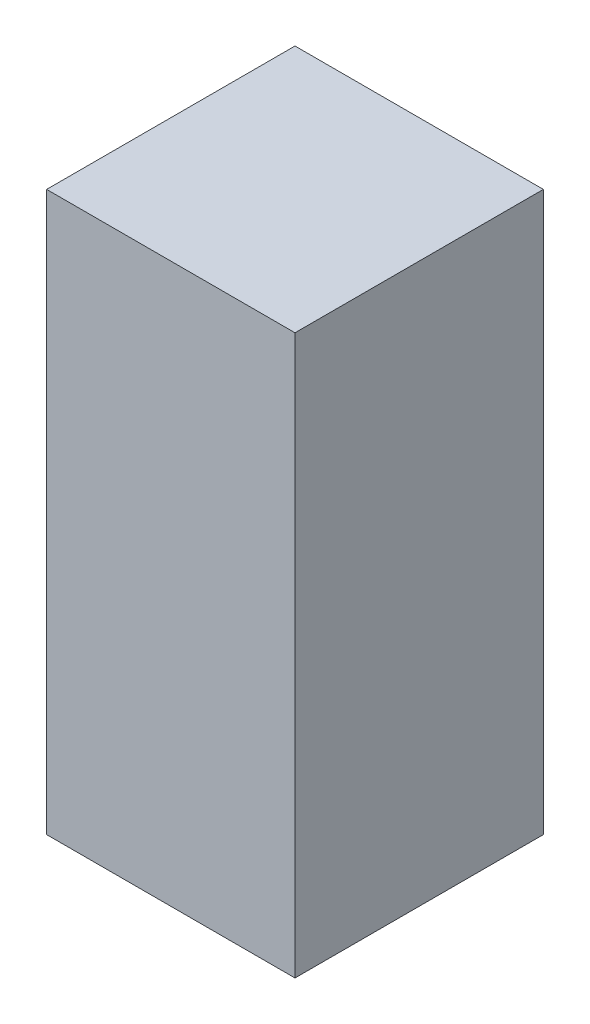
ISO-10303-21;
HEADER;
FILE_DESCRIPTION(('STEP AP214'),'2;1');
FILE_NAME('part.step','',(''),(''),'','','');
FILE_SCHEMA(('AUTOMOTIVE_DESIGN { 1 0 10303 214 1 1 1 1 }'));
ENDSEC;
DATA;
#1=APPLICATION_CONTEXT('core data for automotive mechanical design processes');
#2=APPLICATION_PROTOCOL_DEFINITION('international standard','automotive_design',2000,#1);
#3=PRODUCT_CONTEXT('',#1,'mechanical');
#4=PRODUCT('Part','Part','',(#3));
#5=PRODUCT_RELATED_PRODUCT_CATEGORY('part','',(#4));
#6=PRODUCT_DEFINITION_FORMATION('','',#4);
#7=PRODUCT_DEFINITION_CONTEXT('part definition',#1,'design');
#8=PRODUCT_DEFINITION('design','',#6,#7);
#9=PRODUCT_DEFINITION_SHAPE('','',#8);
#10=(LENGTH_UNIT() NAMED_UNIT(*) SI_UNIT(.MILLI.,.METRE.));
#11=(NAMED_UNIT(*) PLANE_ANGLE_UNIT() SI_UNIT($,.RADIAN.));
#12=(NAMED_UNIT(*) SI_UNIT($,.STERADIAN.) SOLID_ANGLE_UNIT());
#13=UNCERTAINTY_MEASURE_WITH_UNIT(LENGTH_MEASURE(1.E-05),#10,'distance_accuracy_value','');
#14=(GEOMETRIC_REPRESENTATION_CONTEXT(3) GLOBAL_UNCERTAINTY_ASSIGNED_CONTEXT((#13)) GLOBAL_UNIT_ASSIGNED_CONTEXT((#10,
#11,#12)) REPRESENTATION_CONTEXT('',''));
#15=CARTESIAN_POINT('',(0.,0.,0.));
#16=DIRECTION('',(0.,0.,1.));
#17=DIRECTION('',(1.,0.,0.));
#18=AXIS2_PLACEMENT_3D('',#15,#16,#17);
#19=CARTESIAN_POINT('',(-20.,90.,20.));
#20=DIRECTION('',(1.,0.,0.));
#21=DIRECTION('',(0.,0.,-1.));
#22=AXIS2_PLACEMENT_3D('',#19,#20,#21);
#23=PLANE('',#22);
#24=CARTESIAN_POINT('',(-20.,27.5,0.));
#25=DIRECTION('',(-1.,0.,0.));
#26=DIRECTION('',(0.,0.,1.));
#27=AXIS2_PLACEMENT_3D('',#24,#25,#26);
#28=CIRCLE('',#27,2.5);
#29=CARTESIAN_POINT('',(-20.,27.5,2.5));
#30=VERTEX_POINT('',#29);
#31=EDGE_CURVE('E138',#30,#30,#28,.T.);
#32=ORIENTED_EDGE('',*,*,#31,.F.);
#33=EDGE_LOOP('',(#32));
#34=FACE_BOUND('',#33,.T.);
#35=CARTESIAN_POINT('',(-20.,68.3,0.));
#36=DIRECTION('',(-1.,0.,0.));
#37=DIRECTION('',(0.,0.,1.));
#38=AXIS2_PLACEMENT_3D('',#35,#36,#37);
#39=CIRCLE('',#38,3.);
#40=CARTESIAN_POINT('',(-20.,68.3,3.00000000000001));
#41=VERTEX_POINT('',#40);
#42=EDGE_CURVE('E134',#41,#41,#39,.T.);
#43=ORIENTED_EDGE('',*,*,#42,.F.);
#44=EDGE_LOOP('',(#43));
#45=FACE_BOUND('',#44,.T.);
#46=DIRECTION('',(0.,0.,1.));
#47=VECTOR('',#46,1.);
#48=CARTESIAN_POINT('',(-20.,0.,20.));
#49=LINE('',#48,#47);
#50=CARTESIAN_POINT('',(-20.,0.,-20.));
#51=VERTEX_POINT('',#50);
#52=CARTESIAN_POINT('',(-20.,0.,20.));
#53=VERTEX_POINT('',#52);
#54=EDGE_CURVE('E115',#51,#53,#49,.T.);
#55=ORIENTED_EDGE('',*,*,#54,.T.);
#56=DIRECTION('',(0.,-1.,0.));
#57=VECTOR('',#56,1.);
#58=CARTESIAN_POINT('',(-20.,90.,20.));
#59=LINE('',#58,#57);
#60=CARTESIAN_POINT('',(-20.,90.,20.));
#61=VERTEX_POINT('',#60);
#62=EDGE_CURVE('E11',#61,#53,#59,.T.);
#63=ORIENTED_EDGE('',*,*,#62,.F.);
#64=DIRECTION('',(0.,0.,1.));
#65=VECTOR('',#64,1.);
#66=CARTESIAN_POINT('',(-20.,90.,20.));
#67=LINE('',#66,#65);
#68=CARTESIAN_POINT('',(-20.,90.,-20.));
#69=VERTEX_POINT('',#68);
#70=EDGE_CURVE('E102',#69,#61,#67,.T.);
#71=ORIENTED_EDGE('',*,*,#70,.F.);
#72=DIRECTION('',(0.,-1.,0.));
#73=VECTOR('',#72,1.);
#74=CARTESIAN_POINT('',(-20.,90.,-20.));
#75=LINE('',#74,#73);
#76=EDGE_CURVE('E111',#69,#51,#75,.T.);
#77=ORIENTED_EDGE('',*,*,#76,.T.);
#78=EDGE_LOOP('',(#55,#63,#71,#77));
#79=FACE_BOUND('',#78,.T.);
#80=ADVANCED_FACE('F45',(#34,#45,#79),#23,.F.);
#81=CARTESIAN_POINT('',(20.,90.,20.));
#82=DIRECTION('',(0.,0.,-1.));
#83=DIRECTION('',(-1.,0.,0.));
#84=AXIS2_PLACEMENT_3D('',#81,#82,#83);
#85=PLANE('',#84);
#86=DIRECTION('',(1.,0.,0.));
#87=VECTOR('',#86,1.);
#88=CARTESIAN_POINT('',(20.,0.,20.));
#89=LINE('',#88,#87);
#90=CARTESIAN_POINT('',(20.,0.,20.));
#91=VERTEX_POINT('',#90);
#92=EDGE_CURVE('E106',#53,#91,#89,.T.);
#93=ORIENTED_EDGE('',*,*,#92,.T.);
#94=DIRECTION('',(0.,-1.,0.));
#95=VECTOR('',#94,1.);
#96=CARTESIAN_POINT('',(20.,90.,20.));
#97=LINE('',#96,#95);
#98=CARTESIAN_POINT('',(20.,90.,20.));
#99=VERTEX_POINT('',#98);
#100=EDGE_CURVE('E59',#99,#91,#97,.T.);
#101=ORIENTED_EDGE('',*,*,#100,.F.);
#102=DIRECTION('',(1.,0.,0.));
#103=VECTOR('',#102,1.);
#104=CARTESIAN_POINT('',(20.,90.,20.));
#105=LINE('',#104,#103);
#106=EDGE_CURVE('E97',#61,#99,#105,.T.);
#107=ORIENTED_EDGE('',*,*,#106,.F.);
#108=ORIENTED_EDGE('',*,*,#62,.T.);
#109=EDGE_LOOP('',(#93,#101,#107,#108));
#110=FACE_BOUND('',#109,.T.);
#111=ADVANCED_FACE('F105',(#110),#85,.F.);
#112=CARTESIAN_POINT('',(20.,90.,20.));
#113=DIRECTION('',(-1.,0.,0.));
#114=DIRECTION('',(0.,0.,1.));
#115=AXIS2_PLACEMENT_3D('',#112,#113,#114);
#116=PLANE('',#115);
#117=DIRECTION('',(0.,0.,-1.));
#118=VECTOR('',#117,1.);
#119=CARTESIAN_POINT('',(20.,0.,20.));
#120=LINE('',#119,#118);
#121=CARTESIAN_POINT('',(20.,0.,-20.));
#122=VERTEX_POINT('',#121);
#123=EDGE_CURVE('E84',#91,#122,#120,.T.);
#124=ORIENTED_EDGE('',*,*,#123,.T.);
#125=DIRECTION('',(0.,-1.,0.));
#126=VECTOR('',#125,1.);
#127=CARTESIAN_POINT('',(20.,90.,-20.));
#128=LINE('',#127,#126);
#129=CARTESIAN_POINT('',(20.,90.,-20.));
#130=VERTEX_POINT('',#129);
#131=EDGE_CURVE('E107',#130,#122,#128,.T.);
#132=ORIENTED_EDGE('',*,*,#131,.F.);
#133=DIRECTION('',(0.,0.,-1.));
#134=VECTOR('',#133,1.);
#135=CARTESIAN_POINT('',(20.,90.,20.));
#136=LINE('',#135,#134);
#137=EDGE_CURVE('E100',#99,#130,#136,.T.);
#138=ORIENTED_EDGE('',*,*,#137,.F.);
#139=ORIENTED_EDGE('',*,*,#100,.T.);
#140=EDGE_LOOP('',(#124,#132,#138,#139));
#141=FACE_BOUND('',#140,.T.);
#142=ADVANCED_FACE('F109',(#141),#116,.F.);
#143=CARTESIAN_POINT('',(20.,90.,-20.));
#144=DIRECTION('',(0.,0.,1.));
#145=DIRECTION('',(1.,0.,0.));
#146=AXIS2_PLACEMENT_3D('',#143,#144,#145);
#147=PLANE('',#146);
#148=DIRECTION('',(-1.,0.,0.));
#149=VECTOR('',#148,1.);
#150=CARTESIAN_POINT('',(20.,0.,-20.));
#151=LINE('',#150,#149);
#152=EDGE_CURVE('E90',#122,#51,#151,.T.);
#153=ORIENTED_EDGE('',*,*,#152,.T.);
#154=ORIENTED_EDGE('',*,*,#76,.F.);
#155=DIRECTION('',(-1.,0.,0.));
#156=VECTOR('',#155,1.);
#157=CARTESIAN_POINT('',(20.,90.,-20.));
#158=LINE('',#157,#156);
#159=EDGE_CURVE('E67',#130,#69,#158,.T.);
#160=ORIENTED_EDGE('',*,*,#159,.F.);
#161=ORIENTED_EDGE('',*,*,#131,.T.);
#162=EDGE_LOOP('',(#153,#154,#160,#161));
#163=FACE_BOUND('',#162,.T.);
#164=ADVANCED_FACE('F123',(#163),#147,.F.);
#165=CARTESIAN_POINT('',(0.,90.,0.));
#166=DIRECTION('',(0.,1.,0.));
#167=DIRECTION('',(0.,0.,1.));
#168=AXIS2_PLACEMENT_3D('',#165,#166,#167);
#169=PLANE('',#168);
#170=ORIENTED_EDGE('',*,*,#70,.T.);
#171=ORIENTED_EDGE('',*,*,#106,.T.);
#172=ORIENTED_EDGE('',*,*,#137,.T.);
#173=ORIENTED_EDGE('',*,*,#159,.T.);
#174=EDGE_LOOP('',(#170,#171,#172,#173));
#175=FACE_BOUND('',#174,.T.);
#176=ADVANCED_FACE('F98',(#175),#169,.T.);
#177=CARTESIAN_POINT('',(0.,0.,0.));
#178=DIRECTION('',(0.,1.,0.));
#179=DIRECTION('',(0.,0.,1.));
#180=AXIS2_PLACEMENT_3D('',#177,#178,#179);
#181=PLANE('',#180);
#182=CARTESIAN_POINT('',(0.,0.,0.));
#183=DIRECTION('',(0.,1.,0.));
#184=DIRECTION('',(0.,0.,1.));
#185=AXIS2_PLACEMENT_3D('',#182,#183,#184);
#186=CIRCLE('',#185,9.525);
#187=CARTESIAN_POINT('',(0.,0.,9.525));
#188=VERTEX_POINT('',#187);
#189=EDGE_CURVE('E129',#188,#188,#186,.T.);
#190=ORIENTED_EDGE('',*,*,#189,.T.);
#191=EDGE_LOOP('',(#190));
#192=FACE_BOUND('',#191,.T.);
#193=ORIENTED_EDGE('',*,*,#54,.F.);
#194=ORIENTED_EDGE('',*,*,#152,.F.);
#195=ORIENTED_EDGE('',*,*,#123,.F.);
#196=ORIENTED_EDGE('',*,*,#92,.F.);
#197=EDGE_LOOP('',(#193,#194,#195,#196));
#198=FACE_BOUND('',#197,.T.);
#199=ADVANCED_FACE('F126',(#192,#198),#181,.F.);
#200=CARTESIAN_POINT('',(0.,75.,0.));
#201=DIRECTION('',(0.,-1.,0.));
#202=DIRECTION('',(0.,0.,-1.));
#203=AXIS2_PLACEMENT_3D('',#200,#201,#202);
#204=CYLINDRICAL_SURFACE('',#203,9.525);
#205=CARTESIAN_POINT('',(-9.04022261894031,68.3,3.00000000000001));
#206=CARTESIAN_POINT('',(-9.04022347448685,68.1360390629408,2.99999909128888));
#207=CARTESIAN_POINT('',(-9.0447320141542,67.9720686728618,2.98651278890751));
#208=CARTESIAN_POINT('',(-9.06219773181137,67.6489497933908,2.93308138331969));
#209=CARTESIAN_POINT('',(-9.0751570867968,67.4898025575389,2.89312946232248));
#210=CARTESIAN_POINT('',(-9.10791417346948,67.1810576334674,2.78828054322131));
#211=CARTESIAN_POINT('',(-9.12769965032843,67.0314433972076,2.72342822500943));
#212=CARTESIAN_POINT('',(-9.17186254030769,66.7451762923285,2.57076894052959));
#213=CARTESIAN_POINT('',(-9.19624078861972,66.6085257879595,2.48295779809016));
#214=CARTESIAN_POINT('',(-9.2477966172397,66.3472962207846,2.28359156635226));
#215=CARTESIAN_POINT('',(-9.27503837516646,66.2232360885102,2.17137295799509));
#216=CARTESIAN_POINT('',(-9.32870610196767,65.9953476362321,1.92779664380017));
#217=CARTESIAN_POINT('',(-9.35513195459997,65.8915221879751,1.79643622593535));
#218=CARTESIAN_POINT('',(-9.40492553088459,65.7047529971877,1.5145684883538));
#219=CARTESIAN_POINT('',(-9.42820889064359,65.62234474362,1.3636901334725));
#220=CARTESIAN_POINT('',(-9.46834386530664,65.4842768751248,1.04935648219626));
#221=CARTESIAN_POINT('',(-9.48519701702562,65.4286108679952,0.885904202195747));
#222=CARTESIAN_POINT('',(-9.51011838570678,65.3473434242496,0.55649683659792));
#223=CARTESIAN_POINT('',(-9.51844526038878,65.3208548138581,0.390780551212457));
#224=CARTESIAN_POINT('',(-9.52628992806306,65.2958819967855,0.0570605070229995));
#225=CARTESIAN_POINT('',(-9.52580975424429,65.2973913265209,-0.11094271487136));
#226=CARTESIAN_POINT('',(-9.51627397691428,65.3277903287508,-0.43821953030235));
#227=CARTESIAN_POINT('',(-9.5075196613637,65.3557180533446,-0.59759265914395));
#228=CARTESIAN_POINT('',(-9.48279068636715,65.4365812743356,-0.909262643011294));
#229=CARTESIAN_POINT('',(-9.46681555357434,65.4895184101871,-1.06155903341311));
#230=CARTESIAN_POINT('',(-9.42903788175925,65.6195092471507,-1.35695845025673));
#231=CARTESIAN_POINT('',(-9.40716580131375,65.6968527537225,-1.49992468731718));
#232=CARTESIAN_POINT('',(-9.3598955347993,65.8732276461406,-1.77114682270329));
#233=CARTESIAN_POINT('',(-9.33449644695393,65.9722645822597,-1.89939894359712));
#234=CARTESIAN_POINT('',(-9.28160464555387,66.1941434166881,-2.14328682181513));
#235=CARTESIAN_POINT('',(-9.25406881800546,66.3178150702568,-2.25815940974912));
#236=CARTESIAN_POINT('',(-9.20093174985837,66.5829220366651,-2.46576417648096));
#237=CARTESIAN_POINT('',(-9.17533074495444,66.7243595081189,-2.55849366082902));
#238=CARTESIAN_POINT('',(-9.12874228468585,67.023169398857,-2.72008684571376));
#239=CARTESIAN_POINT('',(-9.10781135355888,67.1807065664469,-2.78866341305712));
#240=CARTESIAN_POINT('',(-9.07359480832742,67.5059115924194,-2.89807290468177));
#241=CARTESIAN_POINT('',(-9.06030639596374,67.6735757180028,-2.93891598439233));
#242=CARTESIAN_POINT('',(-9.04350197302399,68.0069540610556,-2.99021745903342));
#243=CARTESIAN_POINT('',(-9.03960980343506,68.1724693206839,-3.00184620700626));
#244=CARTESIAN_POINT('',(-9.04099335516631,68.5030990782636,-2.99767789245238));
#245=CARTESIAN_POINT('',(-9.04626763233211,68.668213635241,-2.98188515012407));
#246=CARTESIAN_POINT('',(-9.06501799696267,68.9882840527251,-2.92436877448038));
#247=CARTESIAN_POINT('',(-9.07824735068798,69.1433959130769,-2.8834244468752));
#248=CARTESIAN_POINT('',(-9.11115468086439,69.4445291970824,-2.77768443390102));
#249=CARTESIAN_POINT('',(-9.1308337199428,69.5905491180599,-2.71288481800227));
#250=CARTESIAN_POINT('',(-9.17513233718511,69.8740470039012,-2.55912718325244));
#251=CARTESIAN_POINT('',(-9.19987879135694,70.0111537752778,-2.4695222592887));
#252=CARTESIAN_POINT('',(-9.25126317900813,70.2688109019879,-2.26945020116984));
#253=CARTESIAN_POINT('',(-9.27790161039878,70.3893568743446,-2.15897756247294));
#254=CARTESIAN_POINT('',(-9.33142865792101,70.6157192198434,-1.91476164498404));
#255=CARTESIAN_POINT('',(-9.35828039528275,70.7206993584568,-1.78023309475756));
#256=CARTESIAN_POINT('',(-9.40808685704539,70.9066299369403,-1.49481807376245));
#257=CARTESIAN_POINT('',(-9.43104175622019,70.9875814546202,-1.3439323371142));
#258=CARTESIAN_POINT('',(-9.47033931516805,71.1223828267628,-1.03099825725635));
#259=CARTESIAN_POINT('',(-9.48672925521985,71.176427176543,-0.86903994072016));
#260=CARTESIAN_POINT('',(-9.51125785386147,71.2563263908949,-0.537724373266353));
#261=CARTESIAN_POINT('',(-9.51939913947539,71.2821902305682,-0.368369495933744));
#262=CARTESIAN_POINT('',(-9.52633625821226,71.3042559450313,-0.0347600060601822));
#263=CARTESIAN_POINT('',(-9.52551238780741,71.3016648178788,0.12940780085247));
#264=CARTESIAN_POINT('',(-9.51552560351422,71.2698197367724,0.454862867655381));
#265=CARTESIAN_POINT('',(-9.5063632480302,71.2405675682314,0.616150319697263));
#266=CARTESIAN_POINT('',(-9.48085159608085,71.157003322672,0.929222086224084));
#267=CARTESIAN_POINT('',(-9.4645963645469,71.1030187905778,1.08110202796888));
#268=CARTESIAN_POINT('',(-9.42657478035654,70.9718188524826,1.37372032534598));
#269=CARTESIAN_POINT('',(-9.40480747548264,70.8945994321917,1.51445675040216));
#270=CARTESIAN_POINT('',(-9.35710102916834,70.7160610157166,1.78604502099345));
#271=CARTESIAN_POINT('',(-9.33104443314126,70.6140064652741,1.91639247210387));
#272=CARTESIAN_POINT('',(-9.27803010990023,70.3899866474774,2.15851178074723));
#273=CARTESIAN_POINT('',(-9.25107211296399,70.2680153773559,2.27027801746612));
#274=CARTESIAN_POINT('',(-9.19822348388723,70.0026827457931,2.47587894740172));
#275=CARTESIAN_POINT('',(-9.17239975851292,69.8587375988542,2.56897958651941));
#276=CARTESIAN_POINT('',(-9.12590239602665,69.5564643012276,2.72957099647452));
#277=CARTESIAN_POINT('',(-9.10522675836239,69.3981417703497,2.79707172081729));
#278=CARTESIAN_POINT('',(-9.0729892115706,69.0847305457334,2.89985578190558));
#279=CARTESIAN_POINT('',(-9.06082683478475,68.9304105638716,2.93729813395143));
#280=CARTESIAN_POINT('',(-9.04444414291201,68.6173959183858,2.98736750042559));
#281=CARTESIAN_POINT('',(-9.04022179083282,68.4587023873876,3.00000087956699));
#282=CARTESIAN_POINT('',(-9.04022261894031,68.3,3.00000000000001));
#283=B_SPLINE_CURVE_WITH_KNOTS('',3,(#205,#206,#207,#208,#209,#210,#211,#212,#213,#214,#215,
#216,#217,#218,#219,#220,#221,#222,#223,#224,#225,#226,#227,#228,#229,#230,#231,#232,#233,#234,
#235,#236,#237,#238,#239,#240,#241,#242,#243,#244,#245,#246,#247,#248,#249,#250,#251,#252,#253,
#254,#255,#256,#257,#258,#259,#260,#261,#262,#263,#264,#265,#266,#267,#268,#269,#270,#271,#272,
#273,#274,#275,#276,#277,#278,#279,#280,#281,#282),.UNSPECIFIED.,.T.,.F.,(4,2,2,2,2,2,2,2,2,2,2,
2,2,2,2,2,2,2,2,2,2,2,2,2,2,2,2,2,2,2,2,2,2,2,2,2,2,2,4),(0.,0.491296406252856,
0.982719424296051,1.47326475013576,1.96389936749712,2.47006218031604,2.97629677654374,
3.49418041246537,4.01194019693621,4.513480694707,5.01490540865234,5.49874765808724,
5.98262162947539,6.47247229262325,6.96244843095688,7.47315091435035,7.98391551016555,
8.50056201615169,9.0170192347087,9.51243082878532,10.0077643788839,10.4884745111067,
10.9692638832748,11.4640151903759,11.9588971870134,12.4746626544976,12.990404983693,
13.5023631489821,14.0141582149925,14.5043308966568,14.9944707552837,15.4782991214541,
15.9622111266598,16.4627158237457,16.9633716490108,17.4809551746901,17.9983372518512,
18.4739988626308,18.949538427028),.UNSPECIFIED.);
#284=CARTESIAN_POINT('',(-9.04022261894031,68.3,3.00000000000001));
#285=VERTEX_POINT('',#284);
#286=EDGE_CURVE('E48',#285,#285,#283,.T.);
#287=ORIENTED_EDGE('',*,*,#286,.F.);
#288=EDGE_LOOP('',(#287));
#289=FACE_BOUND('',#288,.T.);
#290=CARTESIAN_POINT('',(0.,75.,0.));
#291=DIRECTION('',(0.,1.,0.));
#292=DIRECTION('',(0.,0.,1.));
#293=AXIS2_PLACEMENT_3D('',#290,#291,#292);
#294=CIRCLE('',#293,9.525);
#295=CARTESIAN_POINT('',(0.,75.,9.525));
#296=VERTEX_POINT('',#295);
#297=EDGE_CURVE('E118',#296,#296,#294,.T.);
#298=ORIENTED_EDGE('',*,*,#297,.T.);
#299=EDGE_LOOP('',(#298));
#300=FACE_BOUND('',#299,.T.);
#301=ORIENTED_EDGE('',*,*,#189,.F.);
#302=EDGE_LOOP('',(#301));
#303=FACE_BOUND('',#302,.T.);
#304=ADVANCED_FACE('F163',(#289,#300,#303),#204,.F.);
#305=CARTESIAN_POINT('',(0.,75.,0.));
#306=DIRECTION('',(0.,1.,0.));
#307=DIRECTION('',(0.,0.,1.));
#308=AXIS2_PLACEMENT_3D('',#305,#306,#307);
#309=PLANE('',#308);
#310=ORIENTED_EDGE('',*,*,#297,.F.);
#311=EDGE_LOOP('',(#310));
#312=FACE_BOUND('',#311,.T.);
#313=ADVANCED_FACE('F158',(#312),#309,.F.);
#314=CARTESIAN_POINT('',(-3.,68.3,0.));
#315=DIRECTION('',(-1.,0.,0.));
#316=DIRECTION('',(0.,0.,1.));
#317=AXIS2_PLACEMENT_3D('',#314,#315,#316);
#318=CYLINDRICAL_SURFACE('',#317,3.);
#319=ORIENTED_EDGE('',*,*,#286,.T.);
#320=EDGE_LOOP('',(#319));
#321=FACE_BOUND('',#320,.T.);
#322=ORIENTED_EDGE('',*,*,#42,.T.);
#323=EDGE_LOOP('',(#322));
#324=FACE_BOUND('',#323,.T.);
#325=ADVANCED_FACE('F149',(#321,#324),#318,.F.);
#326=CARTESIAN_POINT('',(-12.,27.5,0.));
#327=DIRECTION('',(-1.,0.,0.));
#328=DIRECTION('',(0.,0.,1.));
#329=AXIS2_PLACEMENT_3D('',#326,#327,#328);
#330=CYLINDRICAL_SURFACE('',#329,2.5);
#331=CARTESIAN_POINT('',(-12.,27.5,0.));
#332=DIRECTION('',(-1.,0.,0.));
#333=DIRECTION('',(0.,0.,1.));
#334=AXIS2_PLACEMENT_3D('',#331,#332,#333);
#335=CIRCLE('',#334,2.5);
#336=CARTESIAN_POINT('',(-12.,27.5,2.5));
#337=VERTEX_POINT('',#336);
#338=EDGE_CURVE('E137',#337,#337,#335,.T.);
#339=ORIENTED_EDGE('',*,*,#338,.F.);
#340=EDGE_LOOP('',(#339));
#341=FACE_BOUND('',#340,.T.);
#342=ORIENTED_EDGE('',*,*,#31,.T.);
#343=EDGE_LOOP('',(#342));
#344=FACE_BOUND('',#343,.T.);
#345=ADVANCED_FACE('F146',(#341,#344),#330,.F.);
#346=CARTESIAN_POINT('',(-12.,27.5,0.));
#347=DIRECTION('',(-1.,0.,0.));
#348=DIRECTION('',(0.,0.,1.));
#349=AXIS2_PLACEMENT_3D('',#346,#347,#348);
#350=PLANE('',#349);
#351=ORIENTED_EDGE('',*,*,#338,.T.);
#352=EDGE_LOOP('',(#351));
#353=FACE_BOUND('',#352,.T.);
#354=ADVANCED_FACE('F144',(#353),#350,.T.);
#355=CLOSED_SHELL('',(#80,#111,#142,#164,#176,#199,#304,#313,#325,#345,#354));
#356=MANIFOLD_SOLID_BREP('B2',#355);
#357=ADVANCED_BREP_SHAPE_REPRESENTATION('',(#18,#356),#14);
#358=SHAPE_DEFINITION_REPRESENTATION(#9,#357);
ENDSEC;
END-ISO-10303-21;
